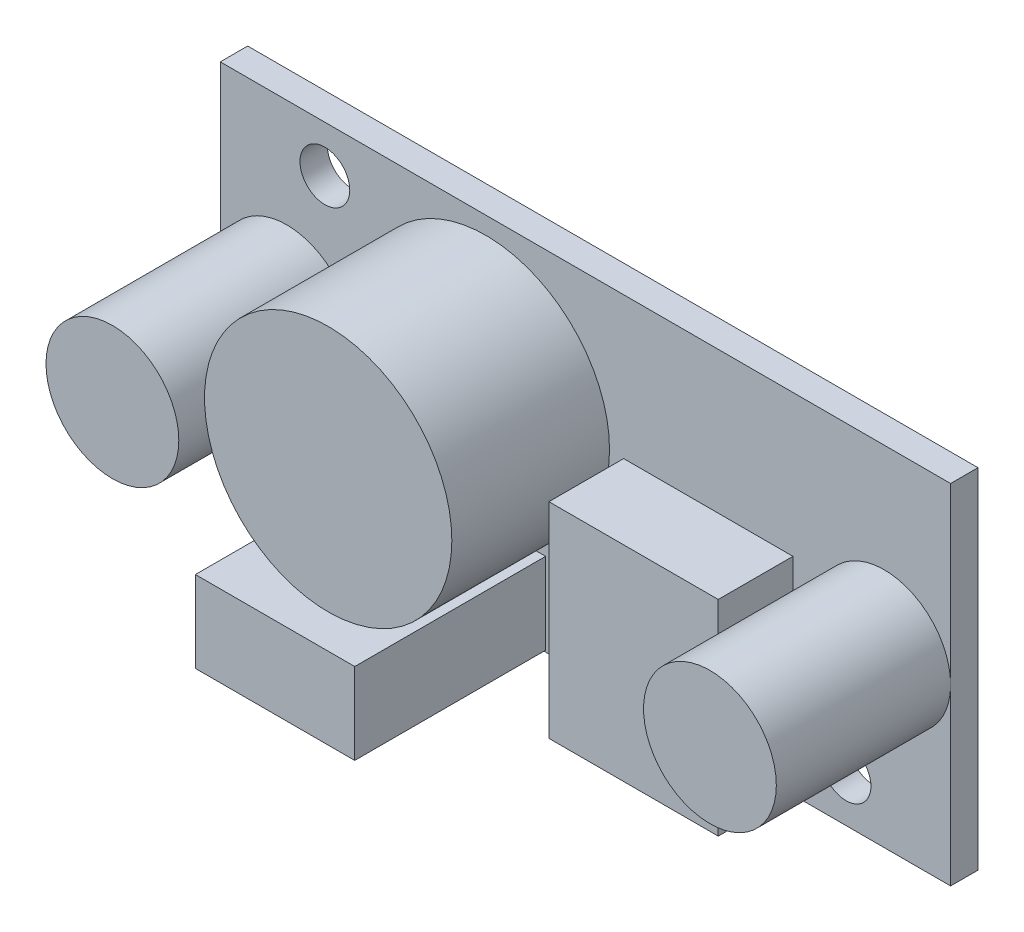
ISO-10303-21;
HEADER;
FILE_DESCRIPTION(('STEP AP214'),'2;1');
FILE_NAME('part.step','',(''),(''),'','','');
FILE_SCHEMA(('AUTOMOTIVE_DESIGN { 1 0 10303 214 1 1 1 1 }'));
ENDSEC;
DATA;
#1=APPLICATION_CONTEXT('core data for automotive mechanical design processes');
#2=APPLICATION_PROTOCOL_DEFINITION('international standard','automotive_design',2000,#1);
#3=PRODUCT_CONTEXT('',#1,'mechanical');
#4=PRODUCT('Part','Part','',(#3));
#5=PRODUCT_RELATED_PRODUCT_CATEGORY('part','',(#4));
#6=PRODUCT_DEFINITION_FORMATION('','',#4);
#7=PRODUCT_DEFINITION_CONTEXT('part definition',#1,'design');
#8=PRODUCT_DEFINITION('design','',#6,#7);
#9=PRODUCT_DEFINITION_SHAPE('','',#8);
#10=(LENGTH_UNIT() NAMED_UNIT(*) SI_UNIT(.MILLI.,.METRE.));
#11=(NAMED_UNIT(*) PLANE_ANGLE_UNIT() SI_UNIT($,.RADIAN.));
#12=(NAMED_UNIT(*) SI_UNIT($,.STERADIAN.) SOLID_ANGLE_UNIT());
#13=UNCERTAINTY_MEASURE_WITH_UNIT(LENGTH_MEASURE(1.E-05),#10,'distance_accuracy_value','');
#14=(GEOMETRIC_REPRESENTATION_CONTEXT(3) GLOBAL_UNCERTAINTY_ASSIGNED_CONTEXT((#13)) GLOBAL_UNIT_ASSIGNED_CONTEXT((#10,
#11,#12)) REPRESENTATION_CONTEXT('',''));
#15=CARTESIAN_POINT('',(0.,0.,0.));
#16=DIRECTION('',(0.,0.,1.));
#17=DIRECTION('',(1.,0.,0.));
#18=AXIS2_PLACEMENT_3D('',#15,#16,#17);
#19=CARTESIAN_POINT('',(0.,0.,1.65));
#20=DIRECTION('',(0.,0.,1.));
#21=DIRECTION('',(1.,0.,0.));
#22=AXIS2_PLACEMENT_3D('',#19,#20,#21);
#23=PLANE('',#22);
#24=DIRECTION('',(0.,-1.,0.));
#25=VECTOR('',#24,1.);
#26=CARTESIAN_POINT('',(12.5,0.,1.65));
#27=LINE('',#26,#25);
#28=CARTESIAN_POINT('',(12.5,1.95,1.65));
#29=VERTEX_POINT('',#28);
#30=CARTESIAN_POINT('',(12.5,-10.4,1.65));
#31=VERTEX_POINT('',#30);
#32=EDGE_CURVE('E141',#29,#31,#27,.T.);
#33=ORIENTED_EDGE('',*,*,#32,.T.);
#34=DIRECTION('',(1.,0.,0.));
#35=VECTOR('',#34,1.);
#36=CARTESIAN_POINT('',(0.,-10.4,1.65));
#37=LINE('',#36,#35);
#38=CARTESIAN_POINT('',(2.30000000000002,-10.4,1.65));
#39=VERTEX_POINT('',#38);
#40=EDGE_CURVE('E155',#39,#31,#37,.T.);
#41=ORIENTED_EDGE('',*,*,#40,.F.);
#42=DIRECTION('',(0.,-1.,0.));
#43=VECTOR('',#42,1.);
#44=CARTESIAN_POINT('',(2.30000000000002,0.,1.65));
#45=LINE('',#44,#43);
#46=CARTESIAN_POINT('',(2.30000000000002,1.95,1.65));
#47=VERTEX_POINT('',#46);
#48=EDGE_CURVE('E168',#47,#39,#45,.T.);
#49=ORIENTED_EDGE('',*,*,#48,.F.);
#50=DIRECTION('',(1.,0.,0.));
#51=VECTOR('',#50,1.);
#52=CARTESIAN_POINT('',(0.,1.95,1.65));
#53=LINE('',#52,#51);
#54=EDGE_CURVE('E166',#47,#29,#53,.T.);
#55=ORIENTED_EDGE('',*,*,#54,.T.);
#56=EDGE_LOOP('',(#33,#41,#49,#55));
#57=FACE_BOUND('',#56,.T.);
#58=CARTESIAN_POINT('',(-5.99999999999999,2.,1.65));
#59=DIRECTION('',(0.,0.,1.));
#60=DIRECTION('',(1.,0.,0.));
#61=AXIS2_PLACEMENT_3D('',#58,#59,#60);
#62=CIRCLE('',#61,7.45);
#63=CARTESIAN_POINT('',(1.45000000000001,2.,1.65));
#64=VERTEX_POINT('',#63);
#65=EDGE_CURVE('E146',#64,#64,#62,.T.);
#66=ORIENTED_EDGE('',*,*,#65,.F.);
#67=EDGE_LOOP('',(#66));
#68=FACE_BOUND('',#67,.T.);
#69=DIRECTION('',(0.,-1.,0.));
#70=VECTOR('',#69,1.);
#71=CARTESIAN_POINT('',(-2.39999999999999,0.,1.65));
#72=LINE('',#71,#70);
#73=CARTESIAN_POINT('',(-2.39999999999999,-5.5,1.65));
#74=VERTEX_POINT('',#73);
#75=CARTESIAN_POINT('',(-2.39999999999999,-10.4,1.65));
#76=VERTEX_POINT('',#75);
#77=EDGE_CURVE('E177',#74,#76,#72,.T.);
#78=ORIENTED_EDGE('',*,*,#77,.T.);
#79=DIRECTION('',(1.,0.,0.));
#80=VECTOR('',#79,1.);
#81=CARTESIAN_POINT('',(0.,-10.4,1.65));
#82=LINE('',#81,#80);
#83=CARTESIAN_POINT('',(-12.,-10.4,1.65));
#84=VERTEX_POINT('',#83);
#85=EDGE_CURVE('E184',#84,#76,#82,.T.);
#86=ORIENTED_EDGE('',*,*,#85,.F.);
#87=DIRECTION('',(0.,-1.,0.));
#88=VECTOR('',#87,1.);
#89=CARTESIAN_POINT('',(-12.,0.,1.65));
#90=LINE('',#89,#88);
#91=CARTESIAN_POINT('',(-12.,-5.5,1.65));
#92=VERTEX_POINT('',#91);
#93=EDGE_CURVE('E197',#92,#84,#90,.T.);
#94=ORIENTED_EDGE('',*,*,#93,.F.);
#95=DIRECTION('',(1.,0.,0.));
#96=VECTOR('',#95,1.);
#97=CARTESIAN_POINT('',(0.,-5.5,1.65));
#98=LINE('',#97,#96);
#99=EDGE_CURVE('E194',#92,#74,#98,.T.);
#100=ORIENTED_EDGE('',*,*,#99,.T.);
#101=EDGE_LOOP('',(#78,#86,#94,#100));
#102=FACE_BOUND('',#101,.T.);
#103=CARTESIAN_POINT('',(-15.7,7.7,1.65));
#104=DIRECTION('',(0.,0.,1.));
#105=DIRECTION('',(1.,0.,0.));
#106=AXIS2_PLACEMENT_3D('',#103,#104,#105);
#107=CIRCLE('',#106,1.5);
#108=CARTESIAN_POINT('',(-14.2,7.7,1.65));
#109=VERTEX_POINT('',#108);
#110=EDGE_CURVE('E224',#109,#109,#107,.T.);
#111=ORIENTED_EDGE('',*,*,#110,.F.);
#112=EDGE_LOOP('',(#111));
#113=FACE_BOUND('',#112,.T.);
#114=DIRECTION('',(0.,1.,0.));
#115=VECTOR('',#114,1.);
#116=CARTESIAN_POINT('',(22.,10.5,1.65));
#117=LINE('',#116,#115);
#118=CARTESIAN_POINT('',(22.,-10.5,1.65));
#119=VERTEX_POINT('',#118);
#120=CARTESIAN_POINT('',(22.,0.,1.65));
#121=VERTEX_POINT('',#120);
#122=EDGE_CURVE('E230',#119,#121,#117,.T.);
#123=ORIENTED_EDGE('',*,*,#122,.T.);
#124=CARTESIAN_POINT('',(18.,0.,1.65));
#125=DIRECTION('',(0.,0.,1.));
#126=DIRECTION('',(1.,0.,0.));
#127=AXIS2_PLACEMENT_3D('',#124,#125,#126);
#128=CIRCLE('',#127,4.);
#129=EDGE_CURVE('E206',#121,#121,#128,.T.);
#130=ORIENTED_EDGE('',*,*,#129,.F.);
#131=CARTESIAN_POINT('',(22.,10.5,1.65));
#132=VERTEX_POINT('',#131);
#133=EDGE_CURVE('E234',#121,#132,#117,.T.);
#134=ORIENTED_EDGE('',*,*,#133,.T.);
#135=DIRECTION('',(-1.,0.,0.));
#136=VECTOR('',#135,1.);
#137=CARTESIAN_POINT('',(-22.,10.5,1.65));
#138=LINE('',#137,#136);
#139=CARTESIAN_POINT('',(-22.,10.5,1.65));
#140=VERTEX_POINT('',#139);
#141=EDGE_CURVE('E233',#132,#140,#138,.T.);
#142=ORIENTED_EDGE('',*,*,#141,.T.);
#143=DIRECTION('',(0.,-1.,0.));
#144=VECTOR('',#143,1.);
#145=CARTESIAN_POINT('',(-22.,10.5,1.65));
#146=LINE('',#145,#144);
#147=CARTESIAN_POINT('',(-22.,0.,1.65));
#148=VERTEX_POINT('',#147);
#149=EDGE_CURVE('E237',#140,#148,#146,.T.);
#150=ORIENTED_EDGE('',*,*,#149,.T.);
#151=CARTESIAN_POINT('',(-18.,0.,1.65));
#152=DIRECTION('',(0.,0.,1.));
#153=DIRECTION('',(1.,0.,0.));
#154=AXIS2_PLACEMENT_3D('',#151,#152,#153);
#155=CIRCLE('',#154,4.);
#156=EDGE_CURVE('E210',#148,#148,#155,.T.);
#157=ORIENTED_EDGE('',*,*,#156,.F.);
#158=CARTESIAN_POINT('',(-22.,-10.5,1.65));
#159=VERTEX_POINT('',#158);
#160=EDGE_CURVE('E236',#148,#159,#146,.T.);
#161=ORIENTED_EDGE('',*,*,#160,.T.);
#162=DIRECTION('',(1.,0.,0.));
#163=VECTOR('',#162,1.);
#164=CARTESIAN_POINT('',(-22.,-10.5,1.65));
#165=LINE('',#164,#163);
#166=EDGE_CURVE('E239',#159,#119,#165,.T.);
#167=ORIENTED_EDGE('',*,*,#166,.T.);
#168=EDGE_LOOP('',(#123,#130,#134,#142,#150,#157,#161,#167));
#169=FACE_BOUND('',#168,.T.);
#170=CARTESIAN_POINT('',(15.6999999999999,-7.70000000000011,1.65));
#171=DIRECTION('',(0.,0.,1.));
#172=DIRECTION('',(1.,0.,0.));
#173=AXIS2_PLACEMENT_3D('',#170,#171,#172);
#174=CIRCLE('',#173,1.5);
#175=CARTESIAN_POINT('',(17.1999999999999,-7.70000000000011,1.65));
#176=VERTEX_POINT('',#175);
#177=EDGE_CURVE('E218',#176,#176,#174,.T.);
#178=ORIENTED_EDGE('',*,*,#177,.F.);
#179=EDGE_LOOP('',(#178));
#180=FACE_BOUND('',#179,.T.);
#181=ADVANCED_FACE('F37',(#57,#68,#102,#113,#169,#180),#23,.T.);
#182=CARTESIAN_POINT('',(0.,0.,0.));
#183=DIRECTION('',(0.,0.,1.));
#184=DIRECTION('',(1.,0.,0.));
#185=AXIS2_PLACEMENT_3D('',#182,#183,#184);
#186=PLANE('',#185);
#187=DIRECTION('',(0.,1.,0.));
#188=VECTOR('',#187,1.);
#189=CARTESIAN_POINT('',(22.,10.5,0.));
#190=LINE('',#189,#188);
#191=CARTESIAN_POINT('',(22.,-10.5,0.));
#192=VERTEX_POINT('',#191);
#193=CARTESIAN_POINT('',(22.,10.5,0.));
#194=VERTEX_POINT('',#193);
#195=EDGE_CURVE('E227',#192,#194,#190,.T.);
#196=ORIENTED_EDGE('',*,*,#195,.F.);
#197=DIRECTION('',(1.,0.,0.));
#198=VECTOR('',#197,1.);
#199=CARTESIAN_POINT('',(-22.,-10.5,0.));
#200=LINE('',#199,#198);
#201=CARTESIAN_POINT('',(-22.,-10.5,0.));
#202=VERTEX_POINT('',#201);
#203=EDGE_CURVE('E248',#202,#192,#200,.T.);
#204=ORIENTED_EDGE('',*,*,#203,.F.);
#205=DIRECTION('',(0.,-1.,0.));
#206=VECTOR('',#205,1.);
#207=CARTESIAN_POINT('',(-22.,10.5,0.));
#208=LINE('',#207,#206);
#209=CARTESIAN_POINT('',(-22.,10.5,0.));
#210=VERTEX_POINT('',#209);
#211=EDGE_CURVE('E246',#210,#202,#208,.T.);
#212=ORIENTED_EDGE('',*,*,#211,.F.);
#213=DIRECTION('',(-1.,0.,0.));
#214=VECTOR('',#213,1.);
#215=CARTESIAN_POINT('',(-22.,10.5,0.));
#216=LINE('',#215,#214);
#217=EDGE_CURVE('E244',#194,#210,#216,.T.);
#218=ORIENTED_EDGE('',*,*,#217,.F.);
#219=EDGE_LOOP('',(#196,#204,#212,#218));
#220=FACE_BOUND('',#219,.T.);
#221=CARTESIAN_POINT('',(-15.7,7.7,0.));
#222=DIRECTION('',(0.,0.,1.));
#223=DIRECTION('',(1.,0.,0.));
#224=AXIS2_PLACEMENT_3D('',#221,#222,#223);
#225=CIRCLE('',#224,1.5);
#226=CARTESIAN_POINT('',(-14.2,7.7,0.));
#227=VERTEX_POINT('',#226);
#228=EDGE_CURVE('E221',#227,#227,#225,.T.);
#229=ORIENTED_EDGE('',*,*,#228,.T.);
#230=EDGE_LOOP('',(#229));
#231=FACE_BOUND('',#230,.T.);
#232=CARTESIAN_POINT('',(15.6999999999999,-7.70000000000011,0.));
#233=DIRECTION('',(0.,0.,1.));
#234=DIRECTION('',(1.,0.,0.));
#235=AXIS2_PLACEMENT_3D('',#232,#233,#234);
#236=CIRCLE('',#235,1.5);
#237=CARTESIAN_POINT('',(17.1999999999999,-7.70000000000011,0.));
#238=VERTEX_POINT('',#237);
#239=EDGE_CURVE('E215',#238,#238,#236,.T.);
#240=ORIENTED_EDGE('',*,*,#239,.T.);
#241=EDGE_LOOP('',(#240));
#242=FACE_BOUND('',#241,.T.);
#243=ADVANCED_FACE('F267',(#220,#231,#242),#186,.F.);
#244=CARTESIAN_POINT('',(22.,10.5,1.65));
#245=DIRECTION('',(-1.,0.,0.));
#246=DIRECTION('',(0.,-1.,0.));
#247=AXIS2_PLACEMENT_3D('',#244,#245,#246);
#248=PLANE('',#247);
#249=ORIENTED_EDGE('',*,*,#195,.T.);
#250=DIRECTION('',(0.,0.,-1.));
#251=VECTOR('',#250,1.);
#252=CARTESIAN_POINT('',(22.,10.5,1.65));
#253=LINE('',#252,#251);
#254=EDGE_CURVE('E11',#132,#194,#253,.T.);
#255=ORIENTED_EDGE('',*,*,#254,.F.);
#256=ORIENTED_EDGE('',*,*,#133,.F.);
#257=ORIENTED_EDGE('',*,*,#122,.F.);
#258=DIRECTION('',(0.,0.,-1.));
#259=VECTOR('',#258,1.);
#260=CARTESIAN_POINT('',(22.,-10.5,1.65));
#261=LINE('',#260,#259);
#262=EDGE_CURVE('E241',#119,#192,#261,.T.);
#263=ORIENTED_EDGE('',*,*,#262,.T.);
#264=EDGE_LOOP('',(#249,#255,#256,#257,#263));
#265=FACE_BOUND('',#264,.T.);
#266=ADVANCED_FACE('F39',(#265),#248,.F.);
#267=CARTESIAN_POINT('',(-22.,10.5,1.65));
#268=DIRECTION('',(0.,-1.,0.));
#269=DIRECTION('',(0.,0.,-1.));
#270=AXIS2_PLACEMENT_3D('',#267,#268,#269);
#271=PLANE('',#270);
#272=ORIENTED_EDGE('',*,*,#217,.T.);
#273=DIRECTION('',(0.,0.,-1.));
#274=VECTOR('',#273,1.);
#275=CARTESIAN_POINT('',(-22.,10.5,1.65));
#276=LINE('',#275,#274);
#277=EDGE_CURVE('E45',#140,#210,#276,.T.);
#278=ORIENTED_EDGE('',*,*,#277,.F.);
#279=ORIENTED_EDGE('',*,*,#141,.F.);
#280=ORIENTED_EDGE('',*,*,#254,.T.);
#281=EDGE_LOOP('',(#272,#278,#279,#280));
#282=FACE_BOUND('',#281,.T.);
#283=ADVANCED_FACE('F312',(#282),#271,.F.);
#284=CARTESIAN_POINT('',(-22.,10.5,1.65));
#285=DIRECTION('',(1.,0.,0.));
#286=DIRECTION('',(0.,1.,0.));
#287=AXIS2_PLACEMENT_3D('',#284,#285,#286);
#288=PLANE('',#287);
#289=ORIENTED_EDGE('',*,*,#211,.T.);
#290=DIRECTION('',(0.,0.,-1.));
#291=VECTOR('',#290,1.);
#292=CARTESIAN_POINT('',(-22.,-10.5,1.65));
#293=LINE('',#292,#291);
#294=EDGE_CURVE('E252',#159,#202,#293,.T.);
#295=ORIENTED_EDGE('',*,*,#294,.F.);
#296=ORIENTED_EDGE('',*,*,#160,.F.);
#297=ORIENTED_EDGE('',*,*,#149,.F.);
#298=ORIENTED_EDGE('',*,*,#277,.T.);
#299=EDGE_LOOP('',(#289,#295,#296,#297,#298));
#300=FACE_BOUND('',#299,.T.);
#301=ADVANCED_FACE('F259',(#300),#288,.F.);
#302=CARTESIAN_POINT('',(-22.,-10.5,1.65));
#303=DIRECTION('',(0.,1.,0.));
#304=DIRECTION('',(0.,0.,1.));
#305=AXIS2_PLACEMENT_3D('',#302,#303,#304);
#306=PLANE('',#305);
#307=ORIENTED_EDGE('',*,*,#203,.T.);
#308=ORIENTED_EDGE('',*,*,#262,.F.);
#309=ORIENTED_EDGE('',*,*,#166,.F.);
#310=ORIENTED_EDGE('',*,*,#294,.T.);
#311=EDGE_LOOP('',(#307,#308,#309,#310));
#312=FACE_BOUND('',#311,.T.);
#313=ADVANCED_FACE('F271',(#312),#306,.F.);
#314=CARTESIAN_POINT('',(-15.7,7.7,1.65));
#315=DIRECTION('',(0.,0.,-1.));
#316=DIRECTION('',(-1.,0.,0.));
#317=AXIS2_PLACEMENT_3D('',#314,#315,#316);
#318=CYLINDRICAL_SURFACE('',#317,1.5);
#319=ORIENTED_EDGE('',*,*,#110,.T.);
#320=EDGE_LOOP('',(#319));
#321=FACE_BOUND('',#320,.T.);
#322=ORIENTED_EDGE('',*,*,#228,.F.);
#323=EDGE_LOOP('',(#322));
#324=FACE_BOUND('',#323,.T.);
#325=ADVANCED_FACE('F295',(#321,#324),#318,.F.);
#326=CARTESIAN_POINT('',(15.6999999999999,-7.70000000000011,1.65));
#327=DIRECTION('',(0.,0.,-1.));
#328=DIRECTION('',(-1.,0.,0.));
#329=AXIS2_PLACEMENT_3D('',#326,#327,#328);
#330=CYLINDRICAL_SURFACE('',#329,1.5);
#331=ORIENTED_EDGE('',*,*,#177,.T.);
#332=EDGE_LOOP('',(#331));
#333=FACE_BOUND('',#332,.T.);
#334=ORIENTED_EDGE('',*,*,#239,.F.);
#335=EDGE_LOOP('',(#334));
#336=FACE_BOUND('',#335,.T.);
#337=ADVANCED_FACE('F285',(#333,#336),#330,.F.);
#338=CARTESIAN_POINT('',(-18.,0.,12.15));
#339=DIRECTION('',(0.,0.,-1.));
#340=DIRECTION('',(-1.,0.,0.));
#341=AXIS2_PLACEMENT_3D('',#338,#339,#340);
#342=CYLINDRICAL_SURFACE('',#341,4.);
#343=CARTESIAN_POINT('',(-18.,0.,12.15));
#344=DIRECTION('',(0.,0.,1.));
#345=DIRECTION('',(1.,0.,0.));
#346=AXIS2_PLACEMENT_3D('',#343,#344,#345);
#347=CIRCLE('',#346,4.);
#348=CARTESIAN_POINT('',(-14.,0.,12.15));
#349=VERTEX_POINT('',#348);
#350=EDGE_CURVE('E212',#349,#349,#347,.T.);
#351=ORIENTED_EDGE('',*,*,#350,.F.);
#352=EDGE_LOOP('',(#351));
#353=FACE_BOUND('',#352,.T.);
#354=ORIENTED_EDGE('',*,*,#156,.T.);
#355=EDGE_LOOP('',(#354));
#356=FACE_BOUND('',#355,.T.);
#357=ADVANCED_FACE('F282',(#353,#356),#342,.T.);
#358=CARTESIAN_POINT('',(0.,0.,12.15));
#359=DIRECTION('',(0.,0.,1.));
#360=DIRECTION('',(1.,0.,0.));
#361=AXIS2_PLACEMENT_3D('',#358,#359,#360);
#362=PLANE('',#361);
#363=ORIENTED_EDGE('',*,*,#350,.T.);
#364=EDGE_LOOP('',(#363));
#365=FACE_BOUND('',#364,.T.);
#366=ADVANCED_FACE('F284',(#365),#362,.T.);
#367=CARTESIAN_POINT('',(18.,0.,12.15));
#368=DIRECTION('',(0.,0.,-1.));
#369=DIRECTION('',(-1.,0.,0.));
#370=AXIS2_PLACEMENT_3D('',#367,#368,#369);
#371=CYLINDRICAL_SURFACE('',#370,4.);
#372=CARTESIAN_POINT('',(18.,0.,12.15));
#373=DIRECTION('',(0.,0.,1.));
#374=DIRECTION('',(1.,0.,0.));
#375=AXIS2_PLACEMENT_3D('',#372,#373,#374);
#376=CIRCLE('',#375,4.);
#377=CARTESIAN_POINT('',(22.,0.,12.15));
#378=VERTEX_POINT('',#377);
#379=EDGE_CURVE('E207',#378,#378,#376,.T.);
#380=ORIENTED_EDGE('',*,*,#379,.F.);
#381=EDGE_LOOP('',(#380));
#382=FACE_BOUND('',#381,.T.);
#383=ORIENTED_EDGE('',*,*,#129,.T.);
#384=EDGE_LOOP('',(#383));
#385=FACE_BOUND('',#384,.T.);
#386=ADVANCED_FACE('F292',(#382,#385),#371,.T.);
#387=CARTESIAN_POINT('',(0.,0.,12.15));
#388=DIRECTION('',(0.,0.,1.));
#389=DIRECTION('',(1.,0.,0.));
#390=AXIS2_PLACEMENT_3D('',#387,#388,#389);
#391=PLANE('',#390);
#392=ORIENTED_EDGE('',*,*,#379,.T.);
#393=EDGE_LOOP('',(#392));
#394=FACE_BOUND('',#393,.T.);
#395=ADVANCED_FACE('F369',(#394),#391,.T.);
#396=CARTESIAN_POINT('',(-2.39999999999999,0.,13.15));
#397=DIRECTION('',(1.,0.,0.));
#398=DIRECTION('',(0.,1.,0.));
#399=AXIS2_PLACEMENT_3D('',#396,#397,#398);
#400=PLANE('',#399);
#401=ORIENTED_EDGE('',*,*,#77,.F.);
#402=DIRECTION('',(0.,0.,-1.));
#403=VECTOR('',#402,1.);
#404=CARTESIAN_POINT('',(-2.39999999999999,-5.5,13.15));
#405=LINE('',#404,#403);
#406=CARTESIAN_POINT('',(-2.39999999999999,-5.5,13.15));
#407=VERTEX_POINT('',#406);
#408=EDGE_CURVE('E204',#407,#74,#405,.T.);
#409=ORIENTED_EDGE('',*,*,#408,.F.);
#410=DIRECTION('',(0.,-1.,0.));
#411=VECTOR('',#410,1.);
#412=CARTESIAN_POINT('',(-2.39999999999999,0.,13.15));
#413=LINE('',#412,#411);
#414=CARTESIAN_POINT('',(-2.39999999999999,-10.4,13.15));
#415=VERTEX_POINT('',#414);
#416=EDGE_CURVE('E180',#407,#415,#413,.T.);
#417=ORIENTED_EDGE('',*,*,#416,.T.);
#418=DIRECTION('',(0.,0.,-1.));
#419=VECTOR('',#418,1.);
#420=CARTESIAN_POINT('',(-2.39999999999999,-10.4,13.15));
#421=LINE('',#420,#419);
#422=EDGE_CURVE('E191',#415,#76,#421,.T.);
#423=ORIENTED_EDGE('',*,*,#422,.T.);
#424=EDGE_LOOP('',(#401,#409,#417,#423));
#425=FACE_BOUND('',#424,.T.);
#426=ADVANCED_FACE('F378',(#425),#400,.T.);
#427=CARTESIAN_POINT('',(0.,-5.5,13.15));
#428=DIRECTION('',(0.,1.,0.));
#429=DIRECTION('',(0.,0.,1.));
#430=AXIS2_PLACEMENT_3D('',#427,#428,#429);
#431=PLANE('',#430);
#432=ORIENTED_EDGE('',*,*,#99,.F.);
#433=DIRECTION('',(0.,0.,-1.));
#434=VECTOR('',#433,1.);
#435=CARTESIAN_POINT('',(-12.,-5.5,13.15));
#436=LINE('',#435,#434);
#437=CARTESIAN_POINT('',(-12.,-5.5,13.15));
#438=VERTEX_POINT('',#437);
#439=EDGE_CURVE('E202',#438,#92,#436,.T.);
#440=ORIENTED_EDGE('',*,*,#439,.F.);
#441=DIRECTION('',(1.,0.,0.));
#442=VECTOR('',#441,1.);
#443=CARTESIAN_POINT('',(0.,-5.5,13.15));
#444=LINE('',#443,#442);
#445=EDGE_CURVE('E183',#438,#407,#444,.T.);
#446=ORIENTED_EDGE('',*,*,#445,.T.);
#447=ORIENTED_EDGE('',*,*,#408,.T.);
#448=EDGE_LOOP('',(#432,#440,#446,#447));
#449=FACE_BOUND('',#448,.T.);
#450=ADVANCED_FACE('F387',(#449),#431,.T.);
#451=CARTESIAN_POINT('',(-12.,0.,13.15));
#452=DIRECTION('',(1.,0.,0.));
#453=DIRECTION('',(0.,0.,-1.));
#454=AXIS2_PLACEMENT_3D('',#451,#452,#453);
#455=PLANE('',#454);
#456=ORIENTED_EDGE('',*,*,#93,.T.);
#457=DIRECTION('',(0.,0.,-1.));
#458=VECTOR('',#457,1.);
#459=CARTESIAN_POINT('',(-12.,-10.4,13.15));
#460=LINE('',#459,#458);
#461=CARTESIAN_POINT('',(-12.,-10.4,13.15));
#462=VERTEX_POINT('',#461);
#463=EDGE_CURVE('E60',#462,#84,#460,.T.);
#464=ORIENTED_EDGE('',*,*,#463,.F.);
#465=DIRECTION('',(0.,-1.,0.));
#466=VECTOR('',#465,1.);
#467=CARTESIAN_POINT('',(-12.,0.,13.15));
#468=LINE('',#467,#466);
#469=EDGE_CURVE('E187',#438,#462,#468,.T.);
#470=ORIENTED_EDGE('',*,*,#469,.F.);
#471=ORIENTED_EDGE('',*,*,#439,.T.);
#472=EDGE_LOOP('',(#456,#464,#470,#471));
#473=FACE_BOUND('',#472,.T.);
#474=ADVANCED_FACE('F396',(#473),#455,.F.);
#475=CARTESIAN_POINT('',(0.,-10.4,13.15));
#476=DIRECTION('',(0.,1.,0.));
#477=DIRECTION('',(0.,0.,1.));
#478=AXIS2_PLACEMENT_3D('',#475,#476,#477);
#479=PLANE('',#478);
#480=ORIENTED_EDGE('',*,*,#85,.T.);
#481=ORIENTED_EDGE('',*,*,#422,.F.);
#482=DIRECTION('',(1.,0.,0.));
#483=VECTOR('',#482,1.);
#484=CARTESIAN_POINT('',(0.,-10.4,13.15));
#485=LINE('',#484,#483);
#486=EDGE_CURVE('E189',#462,#415,#485,.T.);
#487=ORIENTED_EDGE('',*,*,#486,.F.);
#488=ORIENTED_EDGE('',*,*,#463,.T.);
#489=EDGE_LOOP('',(#480,#481,#487,#488));
#490=FACE_BOUND('',#489,.T.);
#491=ADVANCED_FACE('F405',(#490),#479,.F.);
#492=CARTESIAN_POINT('',(0.,0.,13.15));
#493=DIRECTION('',(0.,0.,1.));
#494=DIRECTION('',(1.,0.,0.));
#495=AXIS2_PLACEMENT_3D('',#492,#493,#494);
#496=PLANE('',#495);
#497=ORIENTED_EDGE('',*,*,#416,.F.);
#498=ORIENTED_EDGE('',*,*,#445,.F.);
#499=ORIENTED_EDGE('',*,*,#469,.T.);
#500=ORIENTED_EDGE('',*,*,#486,.T.);
#501=EDGE_LOOP('',(#497,#498,#499,#500));
#502=FACE_BOUND('',#501,.T.);
#503=ADVANCED_FACE('F414',(#502),#496,.T.);
#504=CARTESIAN_POINT('',(-5.99999999999999,2.,11.15));
#505=DIRECTION('',(0.,0.,-1.));
#506=DIRECTION('',(-1.,0.,0.));
#507=AXIS2_PLACEMENT_3D('',#504,#505,#506);
#508=CYLINDRICAL_SURFACE('',#507,7.45);
#509=CARTESIAN_POINT('',(-5.99999999999999,2.,11.15));
#510=DIRECTION('',(0.,0.,1.));
#511=DIRECTION('',(1.,0.,0.));
#512=AXIS2_PLACEMENT_3D('',#509,#510,#511);
#513=CIRCLE('',#512,7.45);
#514=CARTESIAN_POINT('',(1.45000000000001,2.,11.15));
#515=VERTEX_POINT('',#514);
#516=EDGE_CURVE('E174',#515,#515,#513,.T.);
#517=ORIENTED_EDGE('',*,*,#516,.F.);
#518=EDGE_LOOP('',(#517));
#519=FACE_BOUND('',#518,.T.);
#520=ORIENTED_EDGE('',*,*,#65,.T.);
#521=EDGE_LOOP('',(#520));
#522=FACE_BOUND('',#521,.T.);
#523=ADVANCED_FACE('F422',(#519,#522),#508,.T.);
#524=CARTESIAN_POINT('',(0.,0.,11.15));
#525=DIRECTION('',(0.,0.,1.));
#526=DIRECTION('',(1.,0.,0.));
#527=AXIS2_PLACEMENT_3D('',#524,#525,#526);
#528=PLANE('',#527);
#529=ORIENTED_EDGE('',*,*,#516,.T.);
#530=EDGE_LOOP('',(#529));
#531=FACE_BOUND('',#530,.T.);
#532=ADVANCED_FACE('F431',(#531),#528,.T.);
#533=CARTESIAN_POINT('',(12.5,0.,6.15));
#534=DIRECTION('',(1.,0.,0.));
#535=DIRECTION('',(0.,0.,-1.));
#536=AXIS2_PLACEMENT_3D('',#533,#534,#535);
#537=PLANE('',#536);
#538=ORIENTED_EDGE('',*,*,#32,.F.);
#539=DIRECTION('',(0.,0.,-1.));
#540=VECTOR('',#539,1.);
#541=CARTESIAN_POINT('',(12.5,1.95,6.15));
#542=LINE('',#541,#540);
#543=CARTESIAN_POINT('',(12.5,1.95,6.15));
#544=VERTEX_POINT('',#543);
#545=EDGE_CURVE('E136',#544,#29,#542,.T.);
#546=ORIENTED_EDGE('',*,*,#545,.F.);
#547=DIRECTION('',(0.,-1.,0.));
#548=VECTOR('',#547,1.);
#549=CARTESIAN_POINT('',(12.5,0.,6.15));
#550=LINE('',#549,#548);
#551=CARTESIAN_POINT('',(12.5,-10.4,6.15));
#552=VERTEX_POINT('',#551);
#553=EDGE_CURVE('E139',#544,#552,#550,.T.);
#554=ORIENTED_EDGE('',*,*,#553,.T.);
#555=DIRECTION('',(0.,0.,-1.));
#556=VECTOR('',#555,1.);
#557=CARTESIAN_POINT('',(12.5,-10.4,6.15));
#558=LINE('',#557,#556);
#559=EDGE_CURVE('E164',#552,#31,#558,.T.);
#560=ORIENTED_EDGE('',*,*,#559,.T.);
#561=EDGE_LOOP('',(#538,#546,#554,#560));
#562=FACE_BOUND('',#561,.T.);
#563=ADVANCED_FACE('F138',(#562),#537,.T.);
#564=CARTESIAN_POINT('',(0.,1.95,6.15));
#565=DIRECTION('',(0.,1.,0.));
#566=DIRECTION('',(0.,0.,1.));
#567=AXIS2_PLACEMENT_3D('',#564,#565,#566);
#568=PLANE('',#567);
#569=ORIENTED_EDGE('',*,*,#54,.F.);
#570=DIRECTION('',(0.,0.,-1.));
#571=VECTOR('',#570,1.);
#572=CARTESIAN_POINT('',(2.30000000000002,1.95,6.15));
#573=LINE('',#572,#571);
#574=CARTESIAN_POINT('',(2.30000000000002,1.95,6.15));
#575=VERTEX_POINT('',#574);
#576=EDGE_CURVE('E147',#575,#47,#573,.T.);
#577=ORIENTED_EDGE('',*,*,#576,.F.);
#578=DIRECTION('',(1.,0.,0.));
#579=VECTOR('',#578,1.);
#580=CARTESIAN_POINT('',(0.,1.95,6.15));
#581=LINE('',#580,#579);
#582=EDGE_CURVE('E152',#575,#544,#581,.T.);
#583=ORIENTED_EDGE('',*,*,#582,.T.);
#584=ORIENTED_EDGE('',*,*,#545,.T.);
#585=EDGE_LOOP('',(#569,#577,#583,#584));
#586=FACE_BOUND('',#585,.T.);
#587=ADVANCED_FACE('F157',(#586),#568,.T.);
#588=CARTESIAN_POINT('',(2.30000000000002,0.,6.15));
#589=DIRECTION('',(1.,0.,0.));
#590=DIRECTION('',(0.,1.,0.));
#591=AXIS2_PLACEMENT_3D('',#588,#589,#590);
#592=PLANE('',#591);
#593=ORIENTED_EDGE('',*,*,#48,.T.);
#594=DIRECTION('',(0.,0.,-1.));
#595=VECTOR('',#594,1.);
#596=CARTESIAN_POINT('',(2.30000000000002,-10.4,6.15));
#597=LINE('',#596,#595);
#598=CARTESIAN_POINT('',(2.30000000000002,-10.4,6.15));
#599=VERTEX_POINT('',#598);
#600=EDGE_CURVE('E52',#599,#39,#597,.T.);
#601=ORIENTED_EDGE('',*,*,#600,.F.);
#602=DIRECTION('',(0.,-1.,0.));
#603=VECTOR('',#602,1.);
#604=CARTESIAN_POINT('',(2.30000000000002,0.,6.15));
#605=LINE('',#604,#603);
#606=EDGE_CURVE('E159',#575,#599,#605,.T.);
#607=ORIENTED_EDGE('',*,*,#606,.F.);
#608=ORIENTED_EDGE('',*,*,#576,.T.);
#609=EDGE_LOOP('',(#593,#601,#607,#608));
#610=FACE_BOUND('',#609,.T.);
#611=ADVANCED_FACE('F455',(#610),#592,.F.);
#612=CARTESIAN_POINT('',(0.,-10.4,6.15));
#613=DIRECTION('',(0.,1.,0.));
#614=DIRECTION('',(0.,0.,1.));
#615=AXIS2_PLACEMENT_3D('',#612,#613,#614);
#616=PLANE('',#615);
#617=ORIENTED_EDGE('',*,*,#40,.T.);
#618=ORIENTED_EDGE('',*,*,#559,.F.);
#619=DIRECTION('',(1.,0.,0.));
#620=VECTOR('',#619,1.);
#621=CARTESIAN_POINT('',(0.,-10.4,6.15));
#622=LINE('',#621,#620);
#623=EDGE_CURVE('E153',#599,#552,#622,.T.);
#624=ORIENTED_EDGE('',*,*,#623,.F.);
#625=ORIENTED_EDGE('',*,*,#600,.T.);
#626=EDGE_LOOP('',(#617,#618,#624,#625));
#627=FACE_BOUND('',#626,.T.);
#628=ADVANCED_FACE('F463',(#627),#616,.F.);
#629=CARTESIAN_POINT('',(0.,0.,6.15));
#630=DIRECTION('',(0.,0.,1.));
#631=DIRECTION('',(1.,0.,0.));
#632=AXIS2_PLACEMENT_3D('',#629,#630,#631);
#633=PLANE('',#632);
#634=ORIENTED_EDGE('',*,*,#553,.F.);
#635=ORIENTED_EDGE('',*,*,#582,.F.);
#636=ORIENTED_EDGE('',*,*,#606,.T.);
#637=ORIENTED_EDGE('',*,*,#623,.T.);
#638=EDGE_LOOP('',(#634,#635,#636,#637));
#639=FACE_BOUND('',#638,.T.);
#640=ADVANCED_FACE('F151',(#639),#633,.T.);
#641=CLOSED_SHELL('',(#181,#243,#266,#283,#301,#313,#325,#337,#357,#366,#386,#395,#426,#450,
#474,#491,#503,#523,#532,#563,#587,#611,#628,#640));
#642=MANIFOLD_SOLID_BREP('B2',#641);
#643=ADVANCED_BREP_SHAPE_REPRESENTATION('',(#18,#642),#14);
#644=SHAPE_DEFINITION_REPRESENTATION(#9,#643);
ENDSEC;
END-ISO-10303-21;
